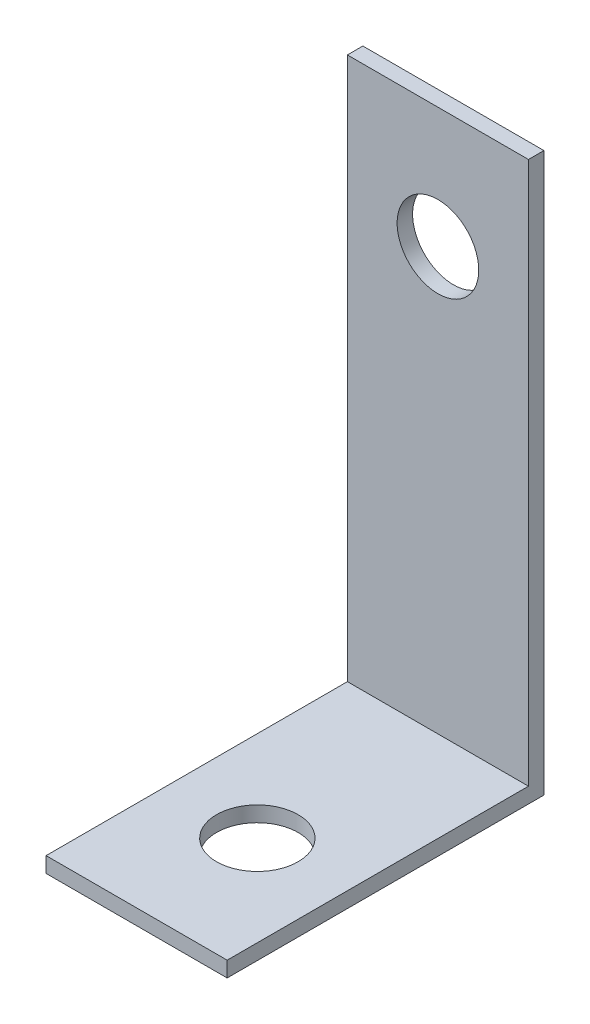
ISO-10303-21;
HEADER;
FILE_DESCRIPTION(('STEP AP214'),'2;1');
FILE_NAME('part.step','',(''),(''),'','','');
FILE_SCHEMA(('AUTOMOTIVE_DESIGN { 1 0 10303 214 1 1 1 1 }'));
ENDSEC;
DATA;
#1=APPLICATION_CONTEXT('core data for automotive mechanical design processes');
#2=APPLICATION_PROTOCOL_DEFINITION('international standard','automotive_design',2000,#1);
#3=PRODUCT_CONTEXT('',#1,'mechanical');
#4=PRODUCT('Part','Part','',(#3));
#5=PRODUCT_RELATED_PRODUCT_CATEGORY('part','',(#4));
#6=PRODUCT_DEFINITION_FORMATION('','',#4);
#7=PRODUCT_DEFINITION_CONTEXT('part definition',#1,'design');
#8=PRODUCT_DEFINITION('design','',#6,#7);
#9=PRODUCT_DEFINITION_SHAPE('','',#8);
#10=(LENGTH_UNIT() NAMED_UNIT(*) SI_UNIT(.MILLI.,.METRE.));
#11=(NAMED_UNIT(*) PLANE_ANGLE_UNIT() SI_UNIT($,.RADIAN.));
#12=(NAMED_UNIT(*) SI_UNIT($,.STERADIAN.) SOLID_ANGLE_UNIT());
#13=UNCERTAINTY_MEASURE_WITH_UNIT(LENGTH_MEASURE(1.E-05),#10,'distance_accuracy_value','');
#14=(GEOMETRIC_REPRESENTATION_CONTEXT(3) GLOBAL_UNCERTAINTY_ASSIGNED_CONTEXT((#13)) GLOBAL_UNIT_ASSIGNED_CONTEXT((#10,
#11,#12)) REPRESENTATION_CONTEXT('',''));
#15=CARTESIAN_POINT('',(0.,0.,0.));
#16=DIRECTION('',(0.,0.,1.));
#17=DIRECTION('',(1.,0.,0.));
#18=AXIS2_PLACEMENT_3D('',#15,#16,#17);
#19=CARTESIAN_POINT('',(0.,0.8128,0.));
#20=DIRECTION('',(0.,-1.,0.));
#21=DIRECTION('',(0.,0.,-1.));
#22=AXIS2_PLACEMENT_3D('',#19,#20,#21);
#23=PLANE('',#22);
#24=CARTESIAN_POINT('',(4.7625,0.8128,-6.35));
#25=DIRECTION('',(0.,1.,0.));
#26=DIRECTION('',(0.,0.,1.));
#27=AXIS2_PLACEMENT_3D('',#24,#25,#26);
#28=CIRCLE('',#27,2.1463);
#29=CARTESIAN_POINT('',(4.7625,0.8128,-4.2037));
#30=VERTEX_POINT('',#29);
#31=EDGE_CURVE('E148',#30,#30,#28,.T.);
#32=ORIENTED_EDGE('',*,*,#31,.F.);
#33=EDGE_LOOP('',(#32));
#34=FACE_BOUND('',#33,.T.);
#35=DIRECTION('',(1.,0.,0.));
#36=VECTOR('',#35,1.);
#37=CARTESIAN_POINT('',(0.,0.8128,-15.8496));
#38=LINE('',#37,#36);
#39=CARTESIAN_POINT('',(0.,0.8128,-15.8496));
#40=VERTEX_POINT('',#39);
#41=CARTESIAN_POINT('',(9.525,0.8128,-15.8496));
#42=VERTEX_POINT('',#41);
#43=EDGE_CURVE('E50',#40,#42,#38,.T.);
#44=ORIENTED_EDGE('',*,*,#43,.F.);
#45=DIRECTION('',(0.,0.,1.));
#46=VECTOR('',#45,1.);
#47=CARTESIAN_POINT('',(0.,0.8128,0.));
#48=LINE('',#47,#46);
#49=CARTESIAN_POINT('',(0.,0.8128,0.));
#50=VERTEX_POINT('',#49);
#51=EDGE_CURVE('E87',#40,#50,#48,.T.);
#52=ORIENTED_EDGE('',*,*,#51,.T.);
#53=DIRECTION('',(1.,0.,0.));
#54=VECTOR('',#53,1.);
#55=CARTESIAN_POINT('',(0.,0.8128,0.));
#56=LINE('',#55,#54);
#57=CARTESIAN_POINT('',(9.525,0.8128,0.));
#58=VERTEX_POINT('',#57);
#59=EDGE_CURVE('E56',#50,#58,#56,.T.);
#60=ORIENTED_EDGE('',*,*,#59,.T.);
#61=DIRECTION('',(0.,0.,-1.));
#62=VECTOR('',#61,1.);
#63=CARTESIAN_POINT('',(9.525,0.8128,0.));
#64=LINE('',#63,#62);
#65=EDGE_CURVE('E98',#58,#42,#64,.T.);
#66=ORIENTED_EDGE('',*,*,#65,.T.);
#67=EDGE_LOOP('',(#44,#52,#60,#66));
#68=FACE_BOUND('',#67,.T.);
#69=ADVANCED_FACE('F33',(#34,#68),#23,.F.);
#70=CARTESIAN_POINT('',(0.,0.8128,0.));
#71=DIRECTION('',(1.,0.,0.));
#72=DIRECTION('',(0.,0.,-1.));
#73=AXIS2_PLACEMENT_3D('',#70,#71,#72);
#74=PLANE('',#73);
#75=DIRECTION('',(0.,0.,1.));
#76=VECTOR('',#75,1.);
#77=CARTESIAN_POINT('',(0.,0.,0.));
#78=LINE('',#77,#76);
#79=CARTESIAN_POINT('',(0.,0.,-16.6624));
#80=VERTEX_POINT('',#79);
#81=CARTESIAN_POINT('',(0.,0.,0.));
#82=VERTEX_POINT('',#81);
#83=EDGE_CURVE('E94',#80,#82,#78,.T.);
#84=ORIENTED_EDGE('',*,*,#83,.T.);
#85=DIRECTION('',(0.,-1.,0.));
#86=VECTOR('',#85,1.);
#87=CARTESIAN_POINT('',(0.,0.8128,0.));
#88=LINE('',#87,#86);
#89=EDGE_CURVE('E11',#50,#82,#88,.T.);
#90=ORIENTED_EDGE('',*,*,#89,.F.);
#91=ORIENTED_EDGE('',*,*,#51,.F.);
#92=DIRECTION('',(0.,-1.,0.));
#93=VECTOR('',#92,1.);
#94=CARTESIAN_POINT('',(0.,29.3624,-15.8496));
#95=LINE('',#94,#93);
#96=CARTESIAN_POINT('',(0.,29.3624,-15.8496));
#97=VERTEX_POINT('',#96);
#98=EDGE_CURVE('E102',#97,#40,#95,.T.);
#99=ORIENTED_EDGE('',*,*,#98,.F.);
#100=DIRECTION('',(0.,0.,1.));
#101=VECTOR('',#100,1.);
#102=CARTESIAN_POINT('',(0.,29.3624,-16.6624));
#103=LINE('',#102,#101);
#104=CARTESIAN_POINT('',(0.,29.3624,-16.6624));
#105=VERTEX_POINT('',#104);
#106=EDGE_CURVE('E97',#105,#97,#103,.T.);
#107=ORIENTED_EDGE('',*,*,#106,.F.);
#108=DIRECTION('',(0.,-1.,0.));
#109=VECTOR('',#108,1.);
#110=CARTESIAN_POINT('',(0.,0.8128,-16.6624));
#111=LINE('',#110,#109);
#112=EDGE_CURVE('E80',#105,#80,#111,.T.);
#113=ORIENTED_EDGE('',*,*,#112,.T.);
#114=EDGE_LOOP('',(#84,#90,#91,#99,#107,#113));
#115=FACE_BOUND('',#114,.T.);
#116=ADVANCED_FACE('F35',(#115),#74,.F.);
#117=CARTESIAN_POINT('',(0.,0.8128,0.));
#118=DIRECTION('',(0.,0.,-1.));
#119=DIRECTION('',(-1.,0.,0.));
#120=AXIS2_PLACEMENT_3D('',#117,#118,#119);
#121=PLANE('',#120);
#122=DIRECTION('',(1.,0.,0.));
#123=VECTOR('',#122,1.);
#124=CARTESIAN_POINT('',(0.,0.,0.));
#125=LINE('',#124,#123);
#126=CARTESIAN_POINT('',(9.525,0.,0.));
#127=VERTEX_POINT('',#126);
#128=EDGE_CURVE('E101',#82,#127,#125,.T.);
#129=ORIENTED_EDGE('',*,*,#128,.T.);
#130=DIRECTION('',(0.,-1.,0.));
#131=VECTOR('',#130,1.);
#132=CARTESIAN_POINT('',(9.525,0.8128,0.));
#133=LINE('',#132,#131);
#134=EDGE_CURVE('E42',#58,#127,#133,.T.);
#135=ORIENTED_EDGE('',*,*,#134,.F.);
#136=ORIENTED_EDGE('',*,*,#59,.F.);
#137=ORIENTED_EDGE('',*,*,#89,.T.);
#138=EDGE_LOOP('',(#129,#135,#136,#137));
#139=FACE_BOUND('',#138,.T.);
#140=ADVANCED_FACE('F184',(#139),#121,.F.);
#141=CARTESIAN_POINT('',(9.525,0.8128,0.));
#142=DIRECTION('',(-1.,0.,0.));
#143=DIRECTION('',(0.,0.,1.));
#144=AXIS2_PLACEMENT_3D('',#141,#142,#143);
#145=PLANE('',#144);
#146=DIRECTION('',(0.,0.,-1.));
#147=VECTOR('',#146,1.);
#148=CARTESIAN_POINT('',(9.525,0.,0.));
#149=LINE('',#148,#147);
#150=CARTESIAN_POINT('',(9.525,0.,-16.6624));
#151=VERTEX_POINT('',#150);
#152=EDGE_CURVE('E88',#127,#151,#149,.T.);
#153=ORIENTED_EDGE('',*,*,#152,.T.);
#154=DIRECTION('',(0.,-1.,0.));
#155=VECTOR('',#154,1.);
#156=CARTESIAN_POINT('',(9.525,0.8128,-16.6624));
#157=LINE('',#156,#155);
#158=CARTESIAN_POINT('',(9.525,29.3624,-16.6624));
#159=VERTEX_POINT('',#158);
#160=EDGE_CURVE('E83',#159,#151,#157,.T.);
#161=ORIENTED_EDGE('',*,*,#160,.F.);
#162=DIRECTION('',(0.,0.,-1.));
#163=VECTOR('',#162,1.);
#164=CARTESIAN_POINT('',(9.525,29.3624,-16.6624));
#165=LINE('',#164,#163);
#166=CARTESIAN_POINT('',(9.525,29.3624,-15.8496));
#167=VERTEX_POINT('',#166);
#168=EDGE_CURVE('E136',#167,#159,#165,.T.);
#169=ORIENTED_EDGE('',*,*,#168,.F.);
#170=DIRECTION('',(0.,-1.,0.));
#171=VECTOR('',#170,1.);
#172=CARTESIAN_POINT('',(9.525,29.3624,-15.8496));
#173=LINE('',#172,#171);
#174=EDGE_CURVE('E106',#167,#42,#173,.T.);
#175=ORIENTED_EDGE('',*,*,#174,.T.);
#176=ORIENTED_EDGE('',*,*,#65,.F.);
#177=ORIENTED_EDGE('',*,*,#134,.T.);
#178=EDGE_LOOP('',(#153,#161,#169,#175,#176,#177));
#179=FACE_BOUND('',#178,.T.);
#180=ADVANCED_FACE('F134',(#179),#145,.F.);
#181=CARTESIAN_POINT('',(0.,0.8128,-16.6624));
#182=DIRECTION('',(0.,0.,1.));
#183=DIRECTION('',(1.,0.,0.));
#184=AXIS2_PLACEMENT_3D('',#181,#182,#183);
#185=PLANE('',#184);
#186=CARTESIAN_POINT('',(4.7625,23.0124,-16.6624));
#187=DIRECTION('',(0.,0.,1.));
#188=DIRECTION('',(1.,0.,0.));
#189=AXIS2_PLACEMENT_3D('',#186,#187,#188);
#190=CIRCLE('',#189,2.1463);
#191=CARTESIAN_POINT('',(6.9088,23.0124,-16.6624));
#192=VERTEX_POINT('',#191);
#193=EDGE_CURVE('E151',#192,#192,#190,.T.);
#194=ORIENTED_EDGE('',*,*,#193,.T.);
#195=EDGE_LOOP('',(#194));
#196=FACE_BOUND('',#195,.T.);
#197=DIRECTION('',(-1.,0.,0.));
#198=VECTOR('',#197,1.);
#199=CARTESIAN_POINT('',(0.,0.,-16.6624));
#200=LINE('',#199,#198);
#201=EDGE_CURVE('E76',#151,#80,#200,.T.);
#202=ORIENTED_EDGE('',*,*,#201,.T.);
#203=ORIENTED_EDGE('',*,*,#112,.F.);
#204=DIRECTION('',(-1.,0.,0.));
#205=VECTOR('',#204,1.);
#206=CARTESIAN_POINT('',(0.,29.3624,-16.6624));
#207=LINE('',#206,#205);
#208=EDGE_CURVE('E137',#159,#105,#207,.T.);
#209=ORIENTED_EDGE('',*,*,#208,.F.);
#210=ORIENTED_EDGE('',*,*,#160,.T.);
#211=EDGE_LOOP('',(#202,#203,#209,#210));
#212=FACE_BOUND('',#211,.T.);
#213=ADVANCED_FACE('F78',(#196,#212),#185,.F.);
#214=CARTESIAN_POINT('',(0.,0.,0.));
#215=DIRECTION('',(0.,-1.,0.));
#216=DIRECTION('',(0.,0.,-1.));
#217=AXIS2_PLACEMENT_3D('',#214,#215,#216);
#218=PLANE('',#217);
#219=CARTESIAN_POINT('',(4.7625,0.,-6.35));
#220=DIRECTION('',(0.,1.,0.));
#221=DIRECTION('',(0.,0.,1.));
#222=AXIS2_PLACEMENT_3D('',#219,#220,#221);
#223=CIRCLE('',#222,2.1463);
#224=CARTESIAN_POINT('',(4.7625,0.,-4.2037));
#225=VERTEX_POINT('',#224);
#226=EDGE_CURVE('E133',#225,#225,#223,.T.);
#227=ORIENTED_EDGE('',*,*,#226,.T.);
#228=EDGE_LOOP('',(#227));
#229=FACE_BOUND('',#228,.T.);
#230=ORIENTED_EDGE('',*,*,#83,.F.);
#231=ORIENTED_EDGE('',*,*,#201,.F.);
#232=ORIENTED_EDGE('',*,*,#152,.F.);
#233=ORIENTED_EDGE('',*,*,#128,.F.);
#234=EDGE_LOOP('',(#230,#231,#232,#233));
#235=FACE_BOUND('',#234,.T.);
#236=ADVANCED_FACE('F100',(#229,#235),#218,.T.);
#237=CARTESIAN_POINT('',(0.,29.3624,-15.8496));
#238=DIRECTION('',(0.,0.,-1.));
#239=DIRECTION('',(-1.,0.,0.));
#240=AXIS2_PLACEMENT_3D('',#237,#238,#239);
#241=PLANE('',#240);
#242=CARTESIAN_POINT('',(4.7625,23.0124,-15.8496));
#243=DIRECTION('',(0.,0.,1.));
#244=DIRECTION('',(1.,0.,0.));
#245=AXIS2_PLACEMENT_3D('',#242,#243,#244);
#246=CIRCLE('',#245,2.1463);
#247=CARTESIAN_POINT('',(6.9088,23.0124,-15.8496));
#248=VERTEX_POINT('',#247);
#249=EDGE_CURVE('E154',#248,#248,#246,.T.);
#250=ORIENTED_EDGE('',*,*,#249,.F.);
#251=EDGE_LOOP('',(#250));
#252=FACE_BOUND('',#251,.T.);
#253=ORIENTED_EDGE('',*,*,#43,.T.);
#254=ORIENTED_EDGE('',*,*,#174,.F.);
#255=DIRECTION('',(1.,0.,0.));
#256=VECTOR('',#255,1.);
#257=CARTESIAN_POINT('',(0.,29.3624,-15.8496));
#258=LINE('',#257,#256);
#259=EDGE_CURVE('E142',#97,#167,#258,.T.);
#260=ORIENTED_EDGE('',*,*,#259,.F.);
#261=ORIENTED_EDGE('',*,*,#98,.T.);
#262=EDGE_LOOP('',(#253,#254,#260,#261));
#263=FACE_BOUND('',#262,.T.);
#264=ADVANCED_FACE('F129',(#252,#263),#241,.F.);
#265=CARTESIAN_POINT('',(0.,29.3624,0.));
#266=DIRECTION('',(0.,1.,0.));
#267=DIRECTION('',(0.,0.,1.));
#268=AXIS2_PLACEMENT_3D('',#265,#266,#267);
#269=PLANE('',#268);
#270=ORIENTED_EDGE('',*,*,#106,.T.);
#271=ORIENTED_EDGE('',*,*,#259,.T.);
#272=ORIENTED_EDGE('',*,*,#168,.T.);
#273=ORIENTED_EDGE('',*,*,#208,.T.);
#274=EDGE_LOOP('',(#270,#271,#272,#273));
#275=FACE_BOUND('',#274,.T.);
#276=ADVANCED_FACE('F169',(#275),#269,.T.);
#277=CARTESIAN_POINT('',(4.7625,0.,-6.35));
#278=DIRECTION('',(0.,1.,0.));
#279=DIRECTION('',(0.,0.,1.));
#280=AXIS2_PLACEMENT_3D('',#277,#278,#279);
#281=CYLINDRICAL_SURFACE('',#280,2.1463);
#282=ORIENTED_EDGE('',*,*,#226,.F.);
#283=EDGE_LOOP('',(#282));
#284=FACE_BOUND('',#283,.T.);
#285=ORIENTED_EDGE('',*,*,#31,.T.);
#286=EDGE_LOOP('',(#285));
#287=FACE_BOUND('',#286,.T.);
#288=ADVANCED_FACE('F164',(#284,#287),#281,.F.);
#289=CARTESIAN_POINT('',(4.7625,23.0124,-16.6624));
#290=DIRECTION('',(0.,0.,1.));
#291=DIRECTION('',(1.,0.,0.));
#292=AXIS2_PLACEMENT_3D('',#289,#290,#291);
#293=CYLINDRICAL_SURFACE('',#292,2.1463);
#294=CARTESIAN_POINT('',(6.9088,23.0124,-16.6624));
#295=CARTESIAN_POINT('',(6.9088,23.0124,-16.6539333333333));
#296=CARTESIAN_POINT('',(6.9088,23.0124,-16.6454666666667));
#297=CARTESIAN_POINT('',(6.9088,23.0124,-16.6285333333333));
#298=CARTESIAN_POINT('',(6.9088,23.0124,-16.6200666666667));
#299=CARTESIAN_POINT('',(6.9088,23.0124,-16.6031333333333));
#300=CARTESIAN_POINT('',(6.9088,23.0124,-16.5946666666667));
#301=CARTESIAN_POINT('',(6.9088,23.0124,-16.5777333333333));
#302=CARTESIAN_POINT('',(6.9088,23.0124,-16.5692666666667));
#303=CARTESIAN_POINT('',(6.9088,23.0124,-16.5523333333333));
#304=CARTESIAN_POINT('',(6.9088,23.0124,-16.5438666666667));
#305=CARTESIAN_POINT('',(6.9088,23.0124,-16.5269333333333));
#306=CARTESIAN_POINT('',(6.9088,23.0124,-16.5184666666667));
#307=CARTESIAN_POINT('',(6.9088,23.0124,-16.5015333333333));
#308=CARTESIAN_POINT('',(6.9088,23.0124,-16.4930666666667));
#309=CARTESIAN_POINT('',(6.9088,23.0124,-16.4761333333333));
#310=CARTESIAN_POINT('',(6.9088,23.0124,-16.4676666666667));
#311=CARTESIAN_POINT('',(6.9088,23.0124,-16.4507333333333));
#312=CARTESIAN_POINT('',(6.9088,23.0124,-16.4422666666667));
#313=CARTESIAN_POINT('',(6.9088,23.0124,-16.4253333333333));
#314=CARTESIAN_POINT('',(6.9088,23.0124,-16.4168666666667));
#315=CARTESIAN_POINT('',(6.9088,23.0124,-16.3999333333333));
#316=CARTESIAN_POINT('',(6.9088,23.0124,-16.3914666666667));
#317=CARTESIAN_POINT('',(6.9088,23.0124,-16.3745333333333));
#318=CARTESIAN_POINT('',(6.9088,23.0124,-16.3660666666667));
#319=CARTESIAN_POINT('',(6.9088,23.0124,-16.3491333333333));
#320=CARTESIAN_POINT('',(6.9088,23.0124,-16.3406666666667));
#321=CARTESIAN_POINT('',(6.9088,23.0124,-16.3237333333333));
#322=CARTESIAN_POINT('',(6.9088,23.0124,-16.3152666666667));
#323=CARTESIAN_POINT('',(6.9088,23.0124,-16.2983333333333));
#324=CARTESIAN_POINT('',(6.9088,23.0124,-16.2898666666667));
#325=CARTESIAN_POINT('',(6.9088,23.0124,-16.2729333333333));
#326=CARTESIAN_POINT('',(6.9088,23.0124,-16.2644666666667));
#327=CARTESIAN_POINT('',(6.9088,23.0124,-16.2475333333333));
#328=CARTESIAN_POINT('',(6.9088,23.0124,-16.2390666666667));
#329=CARTESIAN_POINT('',(6.9088,23.0124,-16.2221333333333));
#330=CARTESIAN_POINT('',(6.9088,23.0124,-16.2136666666667));
#331=CARTESIAN_POINT('',(6.9088,23.0124,-16.1967333333333));
#332=CARTESIAN_POINT('',(6.9088,23.0124,-16.1882666666667));
#333=CARTESIAN_POINT('',(6.9088,23.0124,-16.1713333333333));
#334=CARTESIAN_POINT('',(6.9088,23.0124,-16.1628666666667));
#335=CARTESIAN_POINT('',(6.9088,23.0124,-16.1459333333333));
#336=CARTESIAN_POINT('',(6.9088,23.0124,-16.1374666666667));
#337=CARTESIAN_POINT('',(6.9088,23.0124,-16.1205333333333));
#338=CARTESIAN_POINT('',(6.9088,23.0124,-16.1120666666667));
#339=CARTESIAN_POINT('',(6.9088,23.0124,-16.0951333333333));
#340=CARTESIAN_POINT('',(6.9088,23.0124,-16.0866666666667));
#341=CARTESIAN_POINT('',(6.9088,23.0124,-16.0697333333333));
#342=CARTESIAN_POINT('',(6.9088,23.0124,-16.0612666666667));
#343=CARTESIAN_POINT('',(6.9088,23.0124,-16.0443333333333));
#344=CARTESIAN_POINT('',(6.9088,23.0124,-16.0358666666667));
#345=CARTESIAN_POINT('',(6.9088,23.0124,-16.0189333333333));
#346=CARTESIAN_POINT('',(6.9088,23.0124,-16.0104666666667));
#347=CARTESIAN_POINT('',(6.9088,23.0124,-15.9935333333333));
#348=CARTESIAN_POINT('',(6.9088,23.0124,-15.9850666666667));
#349=CARTESIAN_POINT('',(6.9088,23.0124,-15.9681333333333));
#350=CARTESIAN_POINT('',(6.9088,23.0124,-15.9596666666667));
#351=CARTESIAN_POINT('',(6.9088,23.0124,-15.9427333333333));
#352=CARTESIAN_POINT('',(6.9088,23.0124,-15.9342666666667));
#353=CARTESIAN_POINT('',(6.9088,23.0124,-15.9173333333333));
#354=CARTESIAN_POINT('',(6.9088,23.0124,-15.9088666666667));
#355=CARTESIAN_POINT('',(6.9088,23.0124,-15.8919333333333));
#356=CARTESIAN_POINT('',(6.9088,23.0124,-15.8834666666667));
#357=CARTESIAN_POINT('',(6.9088,23.0124,-15.8665333333333));
#358=CARTESIAN_POINT('',(6.9088,23.0124,-15.8580666666667));
#359=CARTESIAN_POINT('',(6.9088,23.0124,-15.8496));
#360=B_SPLINE_CURVE_WITH_KNOTS('',3,(#294,#295,#296,#297,#298,#299,#300,#301,#302,#303,#304,
#305,#306,#307,#308,#309,#310,#311,#312,#313,#314,#315,#316,#317,#318,#319,#320,#321,#322,#323,
#324,#325,#326,#327,#328,#329,#330,#331,#332,#333,#334,#335,#336,#337,#338,#339,#340,#341,#342,
#343,#344,#345,#346,#347,#348,#349,#350,#351,#352,#353,#354,#355,#356,#357,#358,#359),
.UNSPECIFIED.,.F.,.F.,(4,2,2,2,2,2,2,2,2,2,2,2,2,2,2,2,2,2,2,2,2,2,2,2,2,2,2,2,2,2,2,2,4),(0.,
0.0253999999999983,0.0507999999999967,0.0761999999999985,0.101599999999997,0.126999999999999,
0.152399999999997,0.177799999999999,0.203199999999997,0.228599999999999,0.253999999999997,
0.279399999999999,0.304799999999997,0.330199999999999,0.355599999999998,0.380999999999999,
0.406399999999998,0.431799999999996,0.457199999999998,0.482599999999996,0.507999999999998,
0.533399999999996,0.558799999999998,0.584199999999996,0.609599999999998,0.634999999999997,
0.660399999999999,0.685799999999997,0.711199999999999,0.736599999999997,0.761999999999999,
0.787399999999997,0.812799999999999),.UNSPECIFIED.);
#361=EDGE_CURVE('BSEAM161',#192,#248,#360,.T.);
#362=ORIENTED_EDGE('',*,*,#193,.F.);
#363=ORIENTED_EDGE('',*,*,#249,.T.);
#364=ORIENTED_EDGE('',*,*,#361,.T.);
#365=ORIENTED_EDGE('',*,*,#361,.F.);
#366=EDGE_LOOP('',(#362,#364,#363,#365));
#367=FACE_BOUND('',#366,.T.);
#368=ADVANCED_FACE('F161',(#367),#293,.F.);
#369=CLOSED_SHELL('',(#69,#116,#140,#180,#213,#236,#264,#276,#288,#368));
#370=MANIFOLD_SOLID_BREP('B2',#369);
#371=ADVANCED_BREP_SHAPE_REPRESENTATION('',(#18,#370),#14);
#372=SHAPE_DEFINITION_REPRESENTATION(#9,#371);
ENDSEC;
END-ISO-10303-21;
